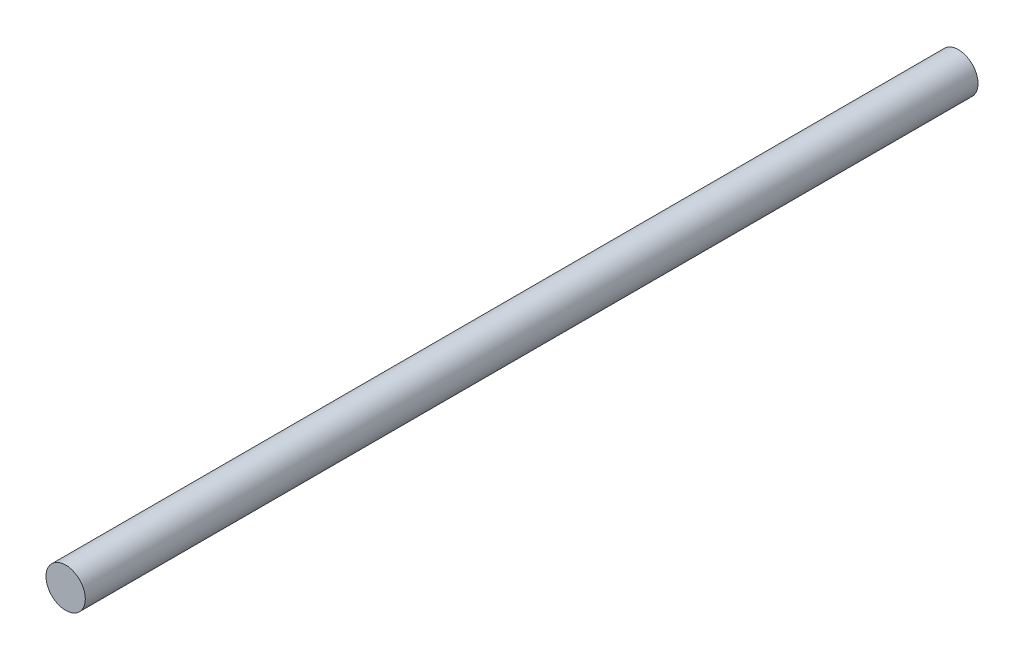
ISO-10303-21;
HEADER;
FILE_DESCRIPTION(('STEP AP214'),'2;1');
FILE_NAME('part.step','',(''),(''),'','','');
FILE_SCHEMA(('AUTOMOTIVE_DESIGN { 1 0 10303 214 1 1 1 1 }'));
ENDSEC;
DATA;
#1=APPLICATION_CONTEXT('core data for automotive mechanical design processes');
#2=APPLICATION_PROTOCOL_DEFINITION('international standard','automotive_design',2000,#1);
#3=PRODUCT_CONTEXT('',#1,'mechanical');
#4=PRODUCT('Part','Part','',(#3));
#5=PRODUCT_RELATED_PRODUCT_CATEGORY('part','',(#4));
#6=PRODUCT_DEFINITION_FORMATION('','',#4);
#7=PRODUCT_DEFINITION_CONTEXT('part definition',#1,'design');
#8=PRODUCT_DEFINITION('design','',#6,#7);
#9=PRODUCT_DEFINITION_SHAPE('','',#8);
#10=(LENGTH_UNIT() NAMED_UNIT(*) SI_UNIT(.MILLI.,.METRE.));
#11=(NAMED_UNIT(*) PLANE_ANGLE_UNIT() SI_UNIT($,.RADIAN.));
#12=(NAMED_UNIT(*) SI_UNIT($,.STERADIAN.) SOLID_ANGLE_UNIT());
#13=UNCERTAINTY_MEASURE_WITH_UNIT(LENGTH_MEASURE(1.E-05),#10,'distance_accuracy_value','');
#14=(GEOMETRIC_REPRESENTATION_CONTEXT(3) GLOBAL_UNCERTAINTY_ASSIGNED_CONTEXT((#13)) GLOBAL_UNIT_ASSIGNED_CONTEXT((#10,
#11,#12)) REPRESENTATION_CONTEXT('',''));
#15=CARTESIAN_POINT('',(0.,0.,0.));
#16=DIRECTION('',(0.,0.,1.));
#17=DIRECTION('',(1.,0.,0.));
#18=AXIS2_PLACEMENT_3D('',#15,#16,#17);
#19=CARTESIAN_POINT('',(0.,0.,35.));
#20=DIRECTION('',(0.,0.,-1.));
#21=DIRECTION('',(-1.,0.,0.));
#22=AXIS2_PLACEMENT_3D('',#19,#20,#21);
#23=CYLINDRICAL_SURFACE('',#22,0.699999999999999);
#24=CARTESIAN_POINT('',(0.,0.,35.));
#25=DIRECTION('',(0.,0.,1.));
#26=DIRECTION('',(1.,0.,0.));
#27=AXIS2_PLACEMENT_3D('',#24,#25,#26);
#28=CIRCLE('',#27,0.699999999999999);
#29=CARTESIAN_POINT('',(0.699999999999999,0.,35.));
#30=VERTEX_POINT('',#29);
#31=EDGE_CURVE('E10',#30,#30,#28,.T.);
#32=ORIENTED_EDGE('',*,*,#31,.F.);
#33=EDGE_LOOP('',(#32));
#34=FACE_BOUND('',#33,.T.);
#35=CARTESIAN_POINT('',(0.,0.,3.2));
#36=DIRECTION('',(0.,0.,-1.));
#37=DIRECTION('',(-1.,0.,0.));
#38=AXIS2_PLACEMENT_3D('',#35,#36,#37);
#39=CIRCLE('',#38,0.699999999999999);
#40=CARTESIAN_POINT('',(-0.699999999999999,0.,3.2));
#41=VERTEX_POINT('',#40);
#42=EDGE_CURVE('E45',#41,#41,#39,.T.);
#43=ORIENTED_EDGE('',*,*,#42,.F.);
#44=EDGE_LOOP('',(#43));
#45=FACE_BOUND('',#44,.T.);
#46=ADVANCED_FACE('F39',(#34,#45),#23,.T.);
#47=CARTESIAN_POINT('',(0.,0.,35.));
#48=DIRECTION('',(0.,0.,1.));
#49=DIRECTION('',(1.,0.,0.));
#50=AXIS2_PLACEMENT_3D('',#47,#48,#49);
#51=PLANE('',#50);
#52=ORIENTED_EDGE('',*,*,#31,.T.);
#53=EDGE_LOOP('',(#52));
#54=FACE_BOUND('',#53,.T.);
#55=ADVANCED_FACE('F53',(#54),#51,.T.);
#56=CARTESIAN_POINT('',(0.,0.,3.2));
#57=DIRECTION('',(0.,0.,-1.));
#58=DIRECTION('',(-1.,0.,0.));
#59=AXIS2_PLACEMENT_3D('',#56,#57,#58);
#60=PLANE('',#59);
#61=ORIENTED_EDGE('',*,*,#42,.T.);
#62=EDGE_LOOP('',(#61));
#63=FACE_BOUND('',#62,.T.);
#64=ADVANCED_FACE('F51',(#63),#60,.T.);
#65=CLOSED_SHELL('',(#46,#55,#64));
#66=MANIFOLD_SOLID_BREP('B2',#65);
#67=ADVANCED_BREP_SHAPE_REPRESENTATION('',(#18,#66),#14);
#68=SHAPE_DEFINITION_REPRESENTATION(#9,#67);
ENDSEC;
END-ISO-10303-21;
